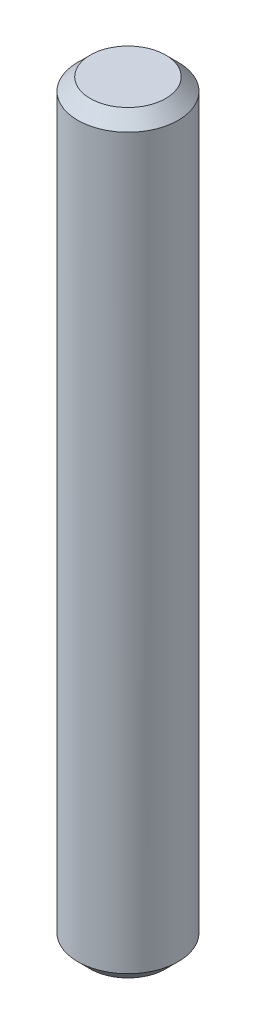
ISO-10303-21;
HEADER;
FILE_DESCRIPTION(('STEP AP214'),'2;1');
FILE_NAME('part.step','',(''),(''),'','','');
FILE_SCHEMA(('AUTOMOTIVE_DESIGN { 1 0 10303 214 1 1 1 1 }'));
ENDSEC;
DATA;
#1=APPLICATION_CONTEXT('core data for automotive mechanical design processes');
#2=APPLICATION_PROTOCOL_DEFINITION('international standard','automotive_design',2000,#1);
#3=PRODUCT_CONTEXT('',#1,'mechanical');
#4=PRODUCT('Part','Part','',(#3));
#5=PRODUCT_RELATED_PRODUCT_CATEGORY('part','',(#4));
#6=PRODUCT_DEFINITION_FORMATION('','',#4);
#7=PRODUCT_DEFINITION_CONTEXT('part definition',#1,'design');
#8=PRODUCT_DEFINITION('design','',#6,#7);
#9=PRODUCT_DEFINITION_SHAPE('','',#8);
#10=(LENGTH_UNIT() NAMED_UNIT(*) SI_UNIT(.MILLI.,.METRE.));
#11=(NAMED_UNIT(*) PLANE_ANGLE_UNIT() SI_UNIT($,.RADIAN.));
#12=(NAMED_UNIT(*) SI_UNIT($,.STERADIAN.) SOLID_ANGLE_UNIT());
#13=UNCERTAINTY_MEASURE_WITH_UNIT(LENGTH_MEASURE(1.E-05),#10,'distance_accuracy_value','');
#14=(GEOMETRIC_REPRESENTATION_CONTEXT(3) GLOBAL_UNCERTAINTY_ASSIGNED_CONTEXT((#13)) GLOBAL_UNIT_ASSIGNED_CONTEXT((#10,
#11,#12)) REPRESENTATION_CONTEXT('',''));
#15=CARTESIAN_POINT('',(0.,0.,0.));
#16=DIRECTION('',(0.,0.,1.));
#17=DIRECTION('',(1.,0.,0.));
#18=AXIS2_PLACEMENT_3D('',#15,#16,#17);
#19=CARTESIAN_POINT('',(0.,-15.,0.));
#20=DIRECTION('',(0.,1.,0.));
#21=DIRECTION('',(-1.,0.,0.));
#22=AXIS2_PLACEMENT_3D('',#19,#20,#21);
#23=PLANE('',#22);
#24=CARTESIAN_POINT('',(0.,-15.,0.));
#25=DIRECTION('',(0.,1.,0.));
#26=DIRECTION('',(-1.,0.,0.));
#27=AXIS2_PLACEMENT_3D('',#24,#25,#26);
#28=CIRCLE('',#27,1.5);
#29=CARTESIAN_POINT('',(-1.5,-15.,0.));
#30=VERTEX_POINT('',#29);
#31=EDGE_CURVE('E38',#30,#30,#28,.F.);
#32=ORIENTED_EDGE('',*,*,#31,.T.);
#33=EDGE_LOOP('',(#32));
#34=FACE_BOUND('',#33,.T.);
#35=ADVANCED_FACE('F31',(#34),#23,.F.);
#36=CARTESIAN_POINT('',(0.,15.,0.));
#37=DIRECTION('',(0.,1.,0.));
#38=DIRECTION('',(-1.,0.,0.));
#39=AXIS2_PLACEMENT_3D('',#36,#37,#38);
#40=CYLINDRICAL_SURFACE('',#39,2.);
#41=CARTESIAN_POINT('',(0.,-14.5,0.));
#42=DIRECTION('',(0.,1.,0.));
#43=DIRECTION('',(-1.,0.,0.));
#44=AXIS2_PLACEMENT_3D('',#41,#42,#43);
#45=CIRCLE('',#44,2.);
#46=CARTESIAN_POINT('',(-2.,-14.5,0.));
#47=VERTEX_POINT('',#46);
#48=EDGE_CURVE('E42',#47,#47,#45,.T.);
#49=ORIENTED_EDGE('',*,*,#48,.T.);
#50=EDGE_LOOP('',(#49));
#51=FACE_BOUND('',#50,.T.);
#52=CARTESIAN_POINT('',(0.,14.5,0.));
#53=DIRECTION('',(0.,-1.,0.));
#54=DIRECTION('',(1.,0.,0.));
#55=AXIS2_PLACEMENT_3D('',#52,#53,#54);
#56=CIRCLE('',#55,2.);
#57=CARTESIAN_POINT('',(1.99999999999999,14.5,0.));
#58=VERTEX_POINT('',#57);
#59=EDGE_CURVE('E46',#58,#58,#56,.T.);
#60=ORIENTED_EDGE('',*,*,#59,.T.);
#61=EDGE_LOOP('',(#60));
#62=FACE_BOUND('',#61,.T.);
#63=ADVANCED_FACE('F52',(#51,#62),#40,.T.);
#64=CARTESIAN_POINT('',(0.,15.,0.));
#65=DIRECTION('',(0.,-1.,0.));
#66=DIRECTION('',(1.,0.,0.));
#67=AXIS2_PLACEMENT_3D('',#64,#65,#66);
#68=PLANE('',#67);
#69=CARTESIAN_POINT('',(0.,15.,0.));
#70=DIRECTION('',(0.,-1.,0.));
#71=DIRECTION('',(1.,0.,0.));
#72=AXIS2_PLACEMENT_3D('',#69,#70,#71);
#73=CIRCLE('',#72,1.5);
#74=CARTESIAN_POINT('',(1.5,15.,0.));
#75=VERTEX_POINT('',#74);
#76=EDGE_CURVE('E10',#75,#75,#73,.F.);
#77=ORIENTED_EDGE('',*,*,#76,.T.);
#78=EDGE_LOOP('',(#77));
#79=FACE_BOUND('',#78,.T.);
#80=ADVANCED_FACE('F60',(#79),#68,.F.);
#81=CARTESIAN_POINT('',(0.,-14.5,0.));
#82=DIRECTION('',(0.,1.,0.));
#83=DIRECTION('',(-1.,0.,0.));
#84=AXIS2_PLACEMENT_3D('',#81,#82,#83);
#85=CONICAL_SURFACE('',#84,2.,0.785398163397446);
#86=ORIENTED_EDGE('',*,*,#31,.F.);
#87=EDGE_LOOP('',(#86));
#88=FACE_BOUND('',#87,.T.);
#89=ORIENTED_EDGE('',*,*,#48,.F.);
#90=EDGE_LOOP('',(#89));
#91=FACE_BOUND('',#90,.T.);
#92=ADVANCED_FACE('F56',(#88,#91),#85,.T.);
#93=CARTESIAN_POINT('',(0.,15.,0.));
#94=DIRECTION('',(0.,-1.,0.));
#95=DIRECTION('',(1.,0.,0.));
#96=AXIS2_PLACEMENT_3D('',#93,#94,#95);
#97=CONICAL_SURFACE('',#96,1.5,0.785398163397445);
#98=ORIENTED_EDGE('',*,*,#59,.F.);
#99=EDGE_LOOP('',(#98));
#100=FACE_BOUND('',#99,.T.);
#101=ORIENTED_EDGE('',*,*,#76,.F.);
#102=EDGE_LOOP('',(#101));
#103=FACE_BOUND('',#102,.T.);
#104=ADVANCED_FACE('F33',(#100,#103),#97,.T.);
#105=CLOSED_SHELL('',(#35,#63,#80,#92,#104));
#106=MANIFOLD_SOLID_BREP('B2',#105);
#107=ADVANCED_BREP_SHAPE_REPRESENTATION('',(#18,#106),#14);
#108=SHAPE_DEFINITION_REPRESENTATION(#9,#107);
ENDSEC;
END-ISO-10303-21;
